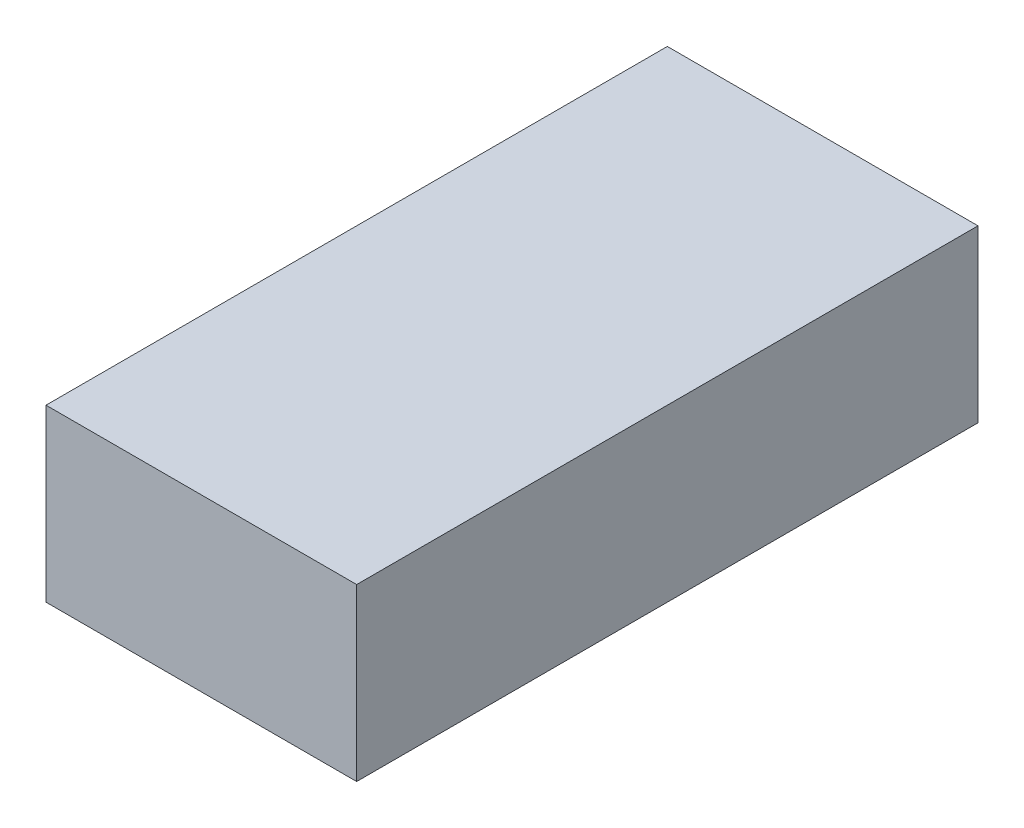
ISO-10303-21;
HEADER;
FILE_DESCRIPTION(('STEP AP214'),'2;1');
FILE_NAME('part.step','',(''),(''),'','','');
FILE_SCHEMA(('AUTOMOTIVE_DESIGN { 1 0 10303 214 1 1 1 1 }'));
ENDSEC;
DATA;
#1=APPLICATION_CONTEXT('core data for automotive mechanical design processes');
#2=APPLICATION_PROTOCOL_DEFINITION('international standard','automotive_design',2000,#1);
#3=PRODUCT_CONTEXT('',#1,'mechanical');
#4=PRODUCT('Part','Part','',(#3));
#5=PRODUCT_RELATED_PRODUCT_CATEGORY('part','',(#4));
#6=PRODUCT_DEFINITION_FORMATION('','',#4);
#7=PRODUCT_DEFINITION_CONTEXT('part definition',#1,'design');
#8=PRODUCT_DEFINITION('design','',#6,#7);
#9=PRODUCT_DEFINITION_SHAPE('','',#8);
#10=(LENGTH_UNIT() NAMED_UNIT(*) SI_UNIT(.MILLI.,.METRE.));
#11=(NAMED_UNIT(*) PLANE_ANGLE_UNIT() SI_UNIT($,.RADIAN.));
#12=(NAMED_UNIT(*) SI_UNIT($,.STERADIAN.) SOLID_ANGLE_UNIT());
#13=UNCERTAINTY_MEASURE_WITH_UNIT(LENGTH_MEASURE(1.E-05),#10,'distance_accuracy_value','');
#14=(GEOMETRIC_REPRESENTATION_CONTEXT(3) GLOBAL_UNCERTAINTY_ASSIGNED_CONTEXT((#13)) GLOBAL_UNIT_ASSIGNED_CONTEXT((#10,
#11,#12)) REPRESENTATION_CONTEXT('',''));
#15=CARTESIAN_POINT('',(0.,0.,0.));
#16=DIRECTION('',(0.,0.,1.));
#17=DIRECTION('',(1.,0.,0.));
#18=AXIS2_PLACEMENT_3D('',#15,#16,#17);
#19=CARTESIAN_POINT('',(2.54,2.79,5.08));
#20=DIRECTION('',(-1.,0.,0.));
#21=DIRECTION('',(0.,0.,1.));
#22=AXIS2_PLACEMENT_3D('',#19,#20,#21);
#23=PLANE('',#22);
#24=DIRECTION('',(0.,0.,-1.));
#25=VECTOR('',#24,1.);
#26=CARTESIAN_POINT('',(2.54,0.,5.08));
#27=LINE('',#26,#25);
#28=CARTESIAN_POINT('',(2.54,0.,5.08));
#29=VERTEX_POINT('',#28);
#30=CARTESIAN_POINT('',(2.54,0.,-5.08));
#31=VERTEX_POINT('',#30);
#32=EDGE_CURVE('E96',#29,#31,#27,.T.);
#33=ORIENTED_EDGE('',*,*,#32,.T.);
#34=DIRECTION('',(0.,-1.,0.));
#35=VECTOR('',#34,1.);
#36=CARTESIAN_POINT('',(2.54,2.79,-5.08));
#37=LINE('',#36,#35);
#38=CARTESIAN_POINT('',(2.54,2.79,-5.08));
#39=VERTEX_POINT('',#38);
#40=EDGE_CURVE('E11',#39,#31,#37,.T.);
#41=ORIENTED_EDGE('',*,*,#40,.F.);
#42=DIRECTION('',(0.,0.,-1.));
#43=VECTOR('',#42,1.);
#44=CARTESIAN_POINT('',(2.54,2.79,5.08));
#45=LINE('',#44,#43);
#46=CARTESIAN_POINT('',(2.54,2.79,5.08));
#47=VERTEX_POINT('',#46);
#48=EDGE_CURVE('E84',#47,#39,#45,.T.);
#49=ORIENTED_EDGE('',*,*,#48,.F.);
#50=DIRECTION('',(0.,-1.,0.));
#51=VECTOR('',#50,1.);
#52=CARTESIAN_POINT('',(2.54,2.79,5.08));
#53=LINE('',#52,#51);
#54=EDGE_CURVE('E92',#47,#29,#53,.T.);
#55=ORIENTED_EDGE('',*,*,#54,.T.);
#56=EDGE_LOOP('',(#33,#41,#49,#55));
#57=FACE_BOUND('',#56,.T.);
#58=ADVANCED_FACE('F33',(#57),#23,.F.);
#59=CARTESIAN_POINT('',(-2.54,2.79,-5.08));
#60=DIRECTION('',(0.,0.,1.));
#61=DIRECTION('',(1.,0.,0.));
#62=AXIS2_PLACEMENT_3D('',#59,#60,#61);
#63=PLANE('',#62);
#64=DIRECTION('',(-1.,0.,0.));
#65=VECTOR('',#64,1.);
#66=CARTESIAN_POINT('',(-2.54,0.,-5.08));
#67=LINE('',#66,#65);
#68=CARTESIAN_POINT('',(-2.54,0.,-5.08));
#69=VERTEX_POINT('',#68);
#70=EDGE_CURVE('E88',#31,#69,#67,.T.);
#71=ORIENTED_EDGE('',*,*,#70,.T.);
#72=DIRECTION('',(0.,-1.,0.));
#73=VECTOR('',#72,1.);
#74=CARTESIAN_POINT('',(-2.54,2.79,-5.08));
#75=LINE('',#74,#73);
#76=CARTESIAN_POINT('',(-2.54,2.79,-5.08));
#77=VERTEX_POINT('',#76);
#78=EDGE_CURVE('E41',#77,#69,#75,.T.);
#79=ORIENTED_EDGE('',*,*,#78,.F.);
#80=DIRECTION('',(-1.,0.,0.));
#81=VECTOR('',#80,1.);
#82=CARTESIAN_POINT('',(-2.54,2.79,-5.08));
#83=LINE('',#82,#81);
#84=EDGE_CURVE('E79',#39,#77,#83,.T.);
#85=ORIENTED_EDGE('',*,*,#84,.F.);
#86=ORIENTED_EDGE('',*,*,#40,.T.);
#87=EDGE_LOOP('',(#71,#79,#85,#86));
#88=FACE_BOUND('',#87,.T.);
#89=ADVANCED_FACE('F87',(#88),#63,.F.);
#90=CARTESIAN_POINT('',(-2.54,2.79,5.08));
#91=DIRECTION('',(1.,0.,0.));
#92=DIRECTION('',(0.,0.,-1.));
#93=AXIS2_PLACEMENT_3D('',#90,#91,#92);
#94=PLANE('',#93);
#95=DIRECTION('',(0.,0.,1.));
#96=VECTOR('',#95,1.);
#97=CARTESIAN_POINT('',(-2.54,0.,5.08));
#98=LINE('',#97,#96);
#99=CARTESIAN_POINT('',(-2.54,0.,5.08));
#100=VERTEX_POINT('',#99);
#101=EDGE_CURVE('E66',#69,#100,#98,.T.);
#102=ORIENTED_EDGE('',*,*,#101,.T.);
#103=DIRECTION('',(0.,-1.,0.));
#104=VECTOR('',#103,1.);
#105=CARTESIAN_POINT('',(-2.54,2.79,5.08));
#106=LINE('',#105,#104);
#107=CARTESIAN_POINT('',(-2.54,2.79,5.08));
#108=VERTEX_POINT('',#107);
#109=EDGE_CURVE('E89',#108,#100,#106,.T.);
#110=ORIENTED_EDGE('',*,*,#109,.F.);
#111=DIRECTION('',(0.,0.,1.));
#112=VECTOR('',#111,1.);
#113=CARTESIAN_POINT('',(-2.54,2.79,5.08));
#114=LINE('',#113,#112);
#115=EDGE_CURVE('E82',#77,#108,#114,.T.);
#116=ORIENTED_EDGE('',*,*,#115,.F.);
#117=ORIENTED_EDGE('',*,*,#78,.T.);
#118=EDGE_LOOP('',(#102,#110,#116,#117));
#119=FACE_BOUND('',#118,.T.);
#120=ADVANCED_FACE('F90',(#119),#94,.F.);
#121=CARTESIAN_POINT('',(-2.54,2.79,5.08));
#122=DIRECTION('',(0.,0.,-1.));
#123=DIRECTION('',(-1.,0.,0.));
#124=AXIS2_PLACEMENT_3D('',#121,#122,#123);
#125=PLANE('',#124);
#126=DIRECTION('',(1.,0.,0.));
#127=VECTOR('',#126,1.);
#128=CARTESIAN_POINT('',(-2.54,0.,5.08));
#129=LINE('',#128,#127);
#130=EDGE_CURVE('E72',#100,#29,#129,.T.);
#131=ORIENTED_EDGE('',*,*,#130,.T.);
#132=ORIENTED_EDGE('',*,*,#54,.F.);
#133=DIRECTION('',(1.,0.,0.));
#134=VECTOR('',#133,1.);
#135=CARTESIAN_POINT('',(-2.54,2.79,5.08));
#136=LINE('',#135,#134);
#137=EDGE_CURVE('E49',#108,#47,#136,.T.);
#138=ORIENTED_EDGE('',*,*,#137,.F.);
#139=ORIENTED_EDGE('',*,*,#109,.T.);
#140=EDGE_LOOP('',(#131,#132,#138,#139));
#141=FACE_BOUND('',#140,.T.);
#142=ADVANCED_FACE('F103',(#141),#125,.F.);
#143=CARTESIAN_POINT('',(0.,2.79,0.));
#144=DIRECTION('',(0.,-1.,0.));
#145=DIRECTION('',(0.,0.,-1.));
#146=AXIS2_PLACEMENT_3D('',#143,#144,#145);
#147=PLANE('',#146);
#148=ORIENTED_EDGE('',*,*,#48,.T.);
#149=ORIENTED_EDGE('',*,*,#84,.T.);
#150=ORIENTED_EDGE('',*,*,#115,.T.);
#151=ORIENTED_EDGE('',*,*,#137,.T.);
#152=EDGE_LOOP('',(#148,#149,#150,#151));
#153=FACE_BOUND('',#152,.T.);
#154=ADVANCED_FACE('F80',(#153),#147,.F.);
#155=CARTESIAN_POINT('',(0.,0.,0.));
#156=DIRECTION('',(0.,-1.,0.));
#157=DIRECTION('',(0.,0.,-1.));
#158=AXIS2_PLACEMENT_3D('',#155,#156,#157);
#159=PLANE('',#158);
#160=ORIENTED_EDGE('',*,*,#32,.F.);
#161=ORIENTED_EDGE('',*,*,#130,.F.);
#162=ORIENTED_EDGE('',*,*,#101,.F.);
#163=ORIENTED_EDGE('',*,*,#70,.F.);
#164=EDGE_LOOP('',(#160,#161,#162,#163));
#165=FACE_BOUND('',#164,.T.);
#166=ADVANCED_FACE('F106',(#165),#159,.T.);
#167=CLOSED_SHELL('',(#58,#89,#120,#142,#154,#166));
#168=MANIFOLD_SOLID_BREP('B2',#167);
#169=ADVANCED_BREP_SHAPE_REPRESENTATION('',(#18,#168),#14);
#170=SHAPE_DEFINITION_REPRESENTATION(#9,#169);
ENDSEC;
END-ISO-10303-21;
